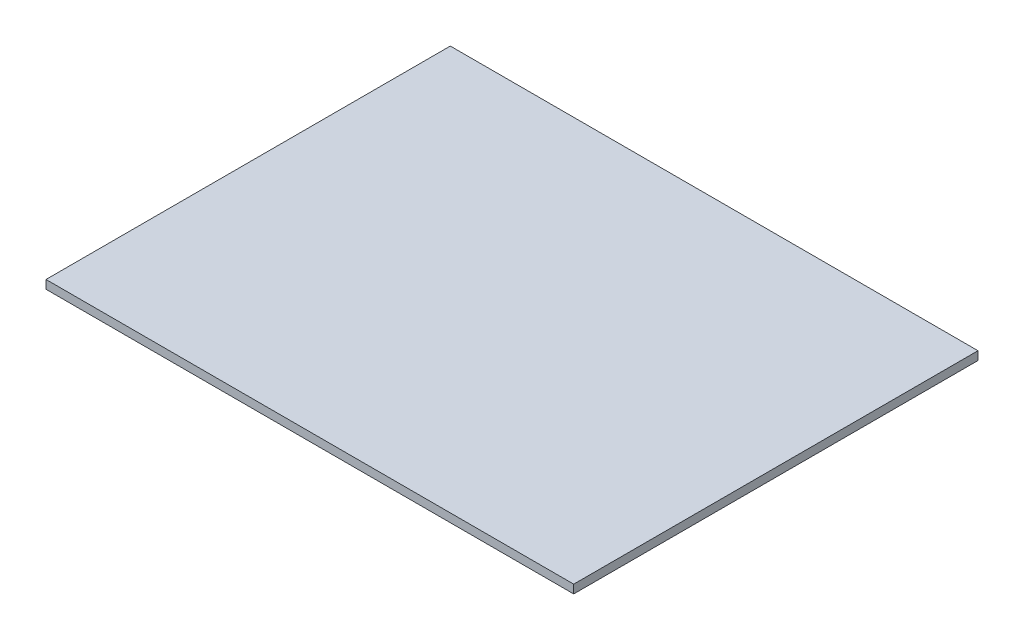
ISO-10303-21;
HEADER;
FILE_DESCRIPTION(('STEP AP214'),'2;1');
FILE_NAME('part.step','',(''),(''),'','','');
FILE_SCHEMA(('AUTOMOTIVE_DESIGN { 1 0 10303 214 1 1 1 1 }'));
ENDSEC;
DATA;
#1=APPLICATION_CONTEXT('core data for automotive mechanical design processes');
#2=APPLICATION_PROTOCOL_DEFINITION('international standard','automotive_design',2000,#1);
#3=PRODUCT_CONTEXT('',#1,'mechanical');
#4=PRODUCT('Part','Part','',(#3));
#5=PRODUCT_RELATED_PRODUCT_CATEGORY('part','',(#4));
#6=PRODUCT_DEFINITION_FORMATION('','',#4);
#7=PRODUCT_DEFINITION_CONTEXT('part definition',#1,'design');
#8=PRODUCT_DEFINITION('design','',#6,#7);
#9=PRODUCT_DEFINITION_SHAPE('','',#8);
#10=(LENGTH_UNIT() NAMED_UNIT(*) SI_UNIT(.MILLI.,.METRE.));
#11=(NAMED_UNIT(*) PLANE_ANGLE_UNIT() SI_UNIT($,.RADIAN.));
#12=(NAMED_UNIT(*) SI_UNIT($,.STERADIAN.) SOLID_ANGLE_UNIT());
#13=UNCERTAINTY_MEASURE_WITH_UNIT(LENGTH_MEASURE(1.E-05),#10,'distance_accuracy_value','');
#14=(GEOMETRIC_REPRESENTATION_CONTEXT(3) GLOBAL_UNCERTAINTY_ASSIGNED_CONTEXT((#13)) GLOBAL_UNIT_ASSIGNED_CONTEXT((#10,
#11,#12)) REPRESENTATION_CONTEXT('',''));
#15=CARTESIAN_POINT('',(0.,0.,0.));
#16=DIRECTION('',(0.,0.,1.));
#17=DIRECTION('',(1.,0.,0.));
#18=AXIS2_PLACEMENT_3D('',#15,#16,#17);
#19=CARTESIAN_POINT('',(248.,8.,190.));
#20=DIRECTION('',(-1.,0.,0.));
#21=DIRECTION('',(0.,0.,1.));
#22=AXIS2_PLACEMENT_3D('',#19,#20,#21);
#23=PLANE('',#22);
#24=DIRECTION('',(0.,0.,-1.));
#25=VECTOR('',#24,1.);
#26=CARTESIAN_POINT('',(248.,0.,190.));
#27=LINE('',#26,#25);
#28=CARTESIAN_POINT('',(248.,0.,190.));
#29=VERTEX_POINT('',#28);
#30=CARTESIAN_POINT('',(248.,0.,-190.));
#31=VERTEX_POINT('',#30);
#32=EDGE_CURVE('E107',#29,#31,#27,.T.);
#33=ORIENTED_EDGE('',*,*,#32,.T.);
#34=DIRECTION('',(0.,-1.,0.));
#35=VECTOR('',#34,1.);
#36=CARTESIAN_POINT('',(248.,8.,-190.));
#37=LINE('',#36,#35);
#38=CARTESIAN_POINT('',(248.,8.,-190.));
#39=VERTEX_POINT('',#38);
#40=EDGE_CURVE('E11',#39,#31,#37,.T.);
#41=ORIENTED_EDGE('',*,*,#40,.F.);
#42=DIRECTION('',(0.,0.,-1.));
#43=VECTOR('',#42,1.);
#44=CARTESIAN_POINT('',(248.,8.,190.));
#45=LINE('',#44,#43);
#46=CARTESIAN_POINT('',(248.,8.,190.));
#47=VERTEX_POINT('',#46);
#48=EDGE_CURVE('E90',#47,#39,#45,.T.);
#49=ORIENTED_EDGE('',*,*,#48,.F.);
#50=DIRECTION('',(0.,-1.,0.));
#51=VECTOR('',#50,1.);
#52=CARTESIAN_POINT('',(248.,8.,190.));
#53=LINE('',#52,#51);
#54=EDGE_CURVE('E103',#47,#29,#53,.T.);
#55=ORIENTED_EDGE('',*,*,#54,.T.);
#56=EDGE_LOOP('',(#33,#41,#49,#55));
#57=FACE_BOUND('',#56,.T.);
#58=ADVANCED_FACE('F38',(#57),#23,.F.);
#59=CARTESIAN_POINT('',(-248.,8.,-190.));
#60=DIRECTION('',(0.,0.,1.));
#61=DIRECTION('',(1.,0.,0.));
#62=AXIS2_PLACEMENT_3D('',#59,#60,#61);
#63=PLANE('',#62);
#64=DIRECTION('',(-1.,0.,0.));
#65=VECTOR('',#64,1.);
#66=CARTESIAN_POINT('',(-248.,0.,-190.));
#67=LINE('',#66,#65);
#68=CARTESIAN_POINT('',(-248.,0.,-190.));
#69=VERTEX_POINT('',#68);
#70=EDGE_CURVE('E95',#31,#69,#67,.T.);
#71=ORIENTED_EDGE('',*,*,#70,.T.);
#72=DIRECTION('',(0.,-1.,0.));
#73=VECTOR('',#72,1.);
#74=CARTESIAN_POINT('',(-248.,8.,-190.));
#75=LINE('',#74,#73);
#76=CARTESIAN_POINT('',(-248.,8.,-190.));
#77=VERTEX_POINT('',#76);
#78=EDGE_CURVE('E47',#77,#69,#75,.T.);
#79=ORIENTED_EDGE('',*,*,#78,.F.);
#80=DIRECTION('',(-1.,0.,0.));
#81=VECTOR('',#80,1.);
#82=CARTESIAN_POINT('',(-248.,8.,-190.));
#83=LINE('',#82,#81);
#84=EDGE_CURVE('E85',#39,#77,#83,.T.);
#85=ORIENTED_EDGE('',*,*,#84,.F.);
#86=ORIENTED_EDGE('',*,*,#40,.T.);
#87=EDGE_LOOP('',(#71,#79,#85,#86));
#88=FACE_BOUND('',#87,.T.);
#89=ADVANCED_FACE('F94',(#88),#63,.F.);
#90=CARTESIAN_POINT('',(-248.,8.,190.));
#91=DIRECTION('',(1.,0.,0.));
#92=DIRECTION('',(0.,0.,-1.));
#93=AXIS2_PLACEMENT_3D('',#90,#91,#92);
#94=PLANE('',#93);
#95=DIRECTION('',(0.,0.,1.));
#96=VECTOR('',#95,1.);
#97=CARTESIAN_POINT('',(-248.,0.,190.));
#98=LINE('',#97,#96);
#99=CARTESIAN_POINT('',(-248.,0.,190.));
#100=VERTEX_POINT('',#99);
#101=EDGE_CURVE('E72',#69,#100,#98,.T.);
#102=ORIENTED_EDGE('',*,*,#101,.T.);
#103=DIRECTION('',(0.,-1.,0.));
#104=VECTOR('',#103,1.);
#105=CARTESIAN_POINT('',(-248.,8.,190.));
#106=LINE('',#105,#104);
#107=CARTESIAN_POINT('',(-248.,8.,190.));
#108=VERTEX_POINT('',#107);
#109=EDGE_CURVE('E97',#108,#100,#106,.T.);
#110=ORIENTED_EDGE('',*,*,#109,.F.);
#111=DIRECTION('',(0.,0.,1.));
#112=VECTOR('',#111,1.);
#113=CARTESIAN_POINT('',(-248.,8.,190.));
#114=LINE('',#113,#112);
#115=EDGE_CURVE('E88',#77,#108,#114,.T.);
#116=ORIENTED_EDGE('',*,*,#115,.F.);
#117=ORIENTED_EDGE('',*,*,#78,.T.);
#118=EDGE_LOOP('',(#102,#110,#116,#117));
#119=FACE_BOUND('',#118,.T.);
#120=ADVANCED_FACE('F98',(#119),#94,.F.);
#121=CARTESIAN_POINT('',(-248.,8.,190.));
#122=DIRECTION('',(0.,0.,-1.));
#123=DIRECTION('',(-1.,0.,0.));
#124=AXIS2_PLACEMENT_3D('',#121,#122,#123);
#125=PLANE('',#124);
#126=DIRECTION('',(1.,0.,0.));
#127=VECTOR('',#126,1.);
#128=CARTESIAN_POINT('',(-248.,0.,190.));
#129=LINE('',#128,#127);
#130=EDGE_CURVE('E78',#100,#29,#129,.T.);
#131=ORIENTED_EDGE('',*,*,#130,.T.);
#132=ORIENTED_EDGE('',*,*,#54,.F.);
#133=DIRECTION('',(1.,0.,0.));
#134=VECTOR('',#133,1.);
#135=CARTESIAN_POINT('',(-248.,8.,190.));
#136=LINE('',#135,#134);
#137=EDGE_CURVE('E55',#108,#47,#136,.T.);
#138=ORIENTED_EDGE('',*,*,#137,.F.);
#139=ORIENTED_EDGE('',*,*,#109,.T.);
#140=EDGE_LOOP('',(#131,#132,#138,#139));
#141=FACE_BOUND('',#140,.T.);
#142=ADVANCED_FACE('F120',(#141),#125,.F.);
#143=CARTESIAN_POINT('',(0.,8.,0.));
#144=DIRECTION('',(0.,-1.,0.));
#145=DIRECTION('',(0.,0.,-1.));
#146=AXIS2_PLACEMENT_3D('',#143,#144,#145);
#147=PLANE('',#146);
#148=ORIENTED_EDGE('',*,*,#48,.T.);
#149=ORIENTED_EDGE('',*,*,#84,.T.);
#150=ORIENTED_EDGE('',*,*,#115,.T.);
#151=ORIENTED_EDGE('',*,*,#137,.T.);
#152=EDGE_LOOP('',(#148,#149,#150,#151));
#153=FACE_BOUND('',#152,.T.);
#154=ADVANCED_FACE('F86',(#153),#147,.F.);
#155=CARTESIAN_POINT('',(0.,0.,0.));
#156=DIRECTION('',(0.,-1.,0.));
#157=DIRECTION('',(0.,0.,-1.));
#158=AXIS2_PLACEMENT_3D('',#155,#156,#157);
#159=PLANE('',#158);
#160=ORIENTED_EDGE('',*,*,#32,.F.);
#161=ORIENTED_EDGE('',*,*,#130,.F.);
#162=ORIENTED_EDGE('',*,*,#101,.F.);
#163=ORIENTED_EDGE('',*,*,#70,.F.);
#164=EDGE_LOOP('',(#160,#161,#162,#163));
#165=FACE_BOUND('',#164,.T.);
#166=ADVANCED_FACE('F123',(#165),#159,.T.);
#167=CLOSED_SHELL('',(#58,#89,#120,#142,#154,#166));
#168=MANIFOLD_SOLID_BREP('B2',#167);
#169=ADVANCED_BREP_SHAPE_REPRESENTATION('',(#18,#168),#14);
#170=SHAPE_DEFINITION_REPRESENTATION(#9,#169);
ENDSEC;
END-ISO-10303-21;
